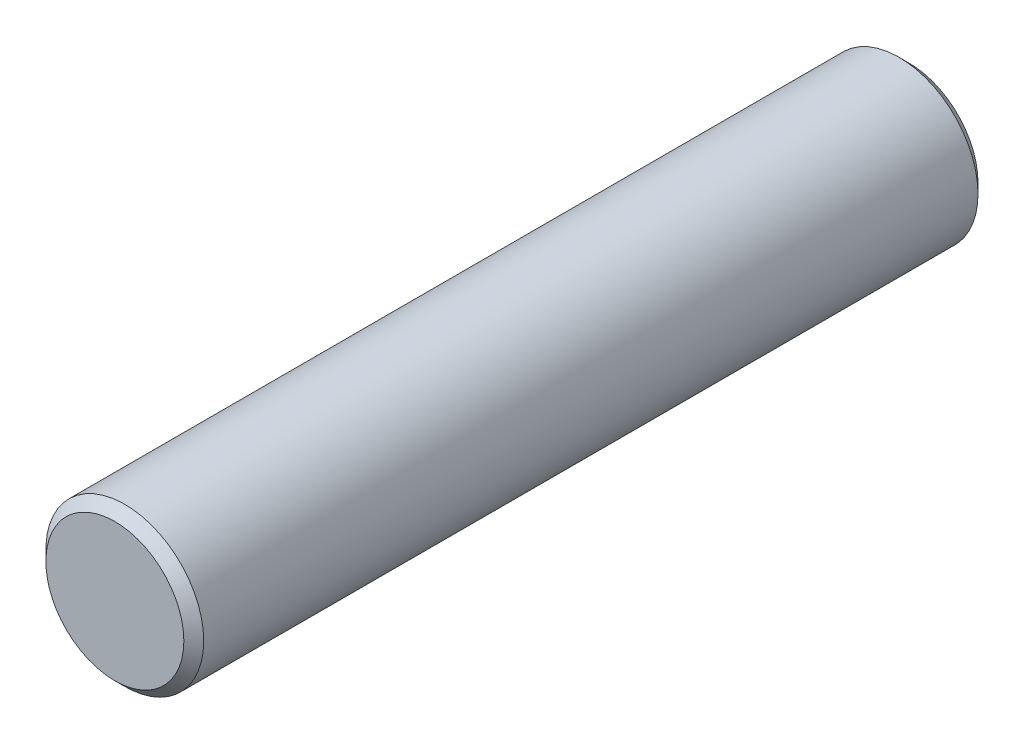
ISO-10303-21;
HEADER;
FILE_DESCRIPTION(('STEP AP214'),'2;1');
FILE_NAME('part.step','',(''),(''),'','','');
FILE_SCHEMA(('AUTOMOTIVE_DESIGN { 1 0 10303 214 1 1 1 1 }'));
ENDSEC;
DATA;
#1=APPLICATION_CONTEXT('core data for automotive mechanical design processes');
#2=APPLICATION_PROTOCOL_DEFINITION('international standard','automotive_design',2000,#1);
#3=PRODUCT_CONTEXT('',#1,'mechanical');
#4=PRODUCT('Part','Part','',(#3));
#5=PRODUCT_RELATED_PRODUCT_CATEGORY('part','',(#4));
#6=PRODUCT_DEFINITION_FORMATION('','',#4);
#7=PRODUCT_DEFINITION_CONTEXT('part definition',#1,'design');
#8=PRODUCT_DEFINITION('design','',#6,#7);
#9=PRODUCT_DEFINITION_SHAPE('','',#8);
#10=(LENGTH_UNIT() NAMED_UNIT(*) SI_UNIT(.MILLI.,.METRE.));
#11=(NAMED_UNIT(*) PLANE_ANGLE_UNIT() SI_UNIT($,.RADIAN.));
#12=(NAMED_UNIT(*) SI_UNIT($,.STERADIAN.) SOLID_ANGLE_UNIT());
#13=UNCERTAINTY_MEASURE_WITH_UNIT(LENGTH_MEASURE(1.E-05),#10,'distance_accuracy_value','');
#14=(GEOMETRIC_REPRESENTATION_CONTEXT(3) GLOBAL_UNCERTAINTY_ASSIGNED_CONTEXT((#13)) GLOBAL_UNIT_ASSIGNED_CONTEXT((#10,
#11,#12)) REPRESENTATION_CONTEXT('',''));
#15=CARTESIAN_POINT('',(0.,0.,0.));
#16=DIRECTION('',(0.,0.,1.));
#17=DIRECTION('',(1.,0.,0.));
#18=AXIS2_PLACEMENT_3D('',#15,#16,#17);
#19=CARTESIAN_POINT('',(0.,0.,40.));
#20=DIRECTION('',(0.,0.,-1.));
#21=DIRECTION('',(-1.,0.,0.));
#22=AXIS2_PLACEMENT_3D('',#19,#20,#21);
#23=CYLINDRICAL_SURFACE('',#22,3.975);
#24=CARTESIAN_POINT('',(0.,0.,0.500000000000007));
#25=DIRECTION('',(0.,0.,1.));
#26=DIRECTION('',(1.,0.,0.));
#27=AXIS2_PLACEMENT_3D('',#24,#25,#26);
#28=CIRCLE('',#27,3.975);
#29=CARTESIAN_POINT('',(3.975,0.,0.500000000000007));
#30=VERTEX_POINT('',#29);
#31=EDGE_CURVE('E42',#30,#30,#28,.T.);
#32=ORIENTED_EDGE('',*,*,#31,.T.);
#33=EDGE_LOOP('',(#32));
#34=FACE_BOUND('',#33,.T.);
#35=CARTESIAN_POINT('',(0.,0.,39.5));
#36=DIRECTION('',(0.,0.,1.));
#37=DIRECTION('',(1.,0.,0.));
#38=AXIS2_PLACEMENT_3D('',#35,#36,#37);
#39=CIRCLE('',#38,3.975);
#40=CARTESIAN_POINT('',(3.975,0.,39.5));
#41=VERTEX_POINT('',#40);
#42=EDGE_CURVE('E46',#41,#41,#39,.F.);
#43=ORIENTED_EDGE('',*,*,#42,.T.);
#44=EDGE_LOOP('',(#43));
#45=FACE_BOUND('',#44,.T.);
#46=ADVANCED_FACE('F31',(#34,#45),#23,.T.);
#47=CARTESIAN_POINT('',(0.,0.,40.));
#48=DIRECTION('',(0.,0.,1.));
#49=DIRECTION('',(1.,0.,0.));
#50=AXIS2_PLACEMENT_3D('',#47,#48,#49);
#51=PLANE('',#50);
#52=CARTESIAN_POINT('',(0.,0.,40.));
#53=DIRECTION('',(0.,0.,1.));
#54=DIRECTION('',(1.,0.,0.));
#55=AXIS2_PLACEMENT_3D('',#52,#53,#54);
#56=CIRCLE('',#55,3.475);
#57=CARTESIAN_POINT('',(3.475,0.,40.));
#58=VERTEX_POINT('',#57);
#59=EDGE_CURVE('E10',#58,#58,#56,.T.);
#60=ORIENTED_EDGE('',*,*,#59,.T.);
#61=EDGE_LOOP('',(#60));
#62=FACE_BOUND('',#61,.T.);
#63=ADVANCED_FACE('F62',(#62),#51,.T.);
#64=CARTESIAN_POINT('',(0.,0.,0.));
#65=DIRECTION('',(0.,0.,1.));
#66=DIRECTION('',(1.,0.,0.));
#67=AXIS2_PLACEMENT_3D('',#64,#65,#66);
#68=PLANE('',#67);
#69=CARTESIAN_POINT('',(0.,0.,0.));
#70=DIRECTION('',(0.,0.,1.));
#71=DIRECTION('',(1.,0.,0.));
#72=AXIS2_PLACEMENT_3D('',#69,#70,#71);
#73=CIRCLE('',#72,3.47499999999999);
#74=CARTESIAN_POINT('',(3.47499999999999,0.,0.));
#75=VERTEX_POINT('',#74);
#76=EDGE_CURVE('E38',#75,#75,#73,.F.);
#77=ORIENTED_EDGE('',*,*,#76,.T.);
#78=EDGE_LOOP('',(#77));
#79=FACE_BOUND('',#78,.T.);
#80=ADVANCED_FACE('F59',(#79),#68,.F.);
#81=CARTESIAN_POINT('',(0.,0.,0.500000000000007));
#82=DIRECTION('',(0.,0.,1.));
#83=DIRECTION('',(1.,0.,0.));
#84=AXIS2_PLACEMENT_3D('',#81,#82,#83);
#85=CONICAL_SURFACE('',#84,3.975,0.785398163397453);
#86=ORIENTED_EDGE('',*,*,#76,.F.);
#87=EDGE_LOOP('',(#86));
#88=FACE_BOUND('',#87,.T.);
#89=ORIENTED_EDGE('',*,*,#31,.F.);
#90=EDGE_LOOP('',(#89));
#91=FACE_BOUND('',#90,.T.);
#92=ADVANCED_FACE('F55',(#88,#91),#85,.T.);
#93=CARTESIAN_POINT('',(0.,0.,40.));
#94=DIRECTION('',(0.,0.,-1.));
#95=DIRECTION('',(-1.,0.,0.));
#96=AXIS2_PLACEMENT_3D('',#93,#94,#95);
#97=CONICAL_SURFACE('',#96,3.475,0.785398163397456);
#98=ORIENTED_EDGE('',*,*,#42,.F.);
#99=EDGE_LOOP('',(#98));
#100=FACE_BOUND('',#99,.T.);
#101=ORIENTED_EDGE('',*,*,#59,.F.);
#102=EDGE_LOOP('',(#101));
#103=FACE_BOUND('',#102,.T.);
#104=ADVANCED_FACE('F33',(#100,#103),#97,.T.);
#105=CLOSED_SHELL('',(#46,#63,#80,#92,#104));
#106=MANIFOLD_SOLID_BREP('B2',#105);
#107=ADVANCED_BREP_SHAPE_REPRESENTATION('',(#18,#106),#14);
#108=SHAPE_DEFINITION_REPRESENTATION(#9,#107);
ENDSEC;
END-ISO-10303-21;
